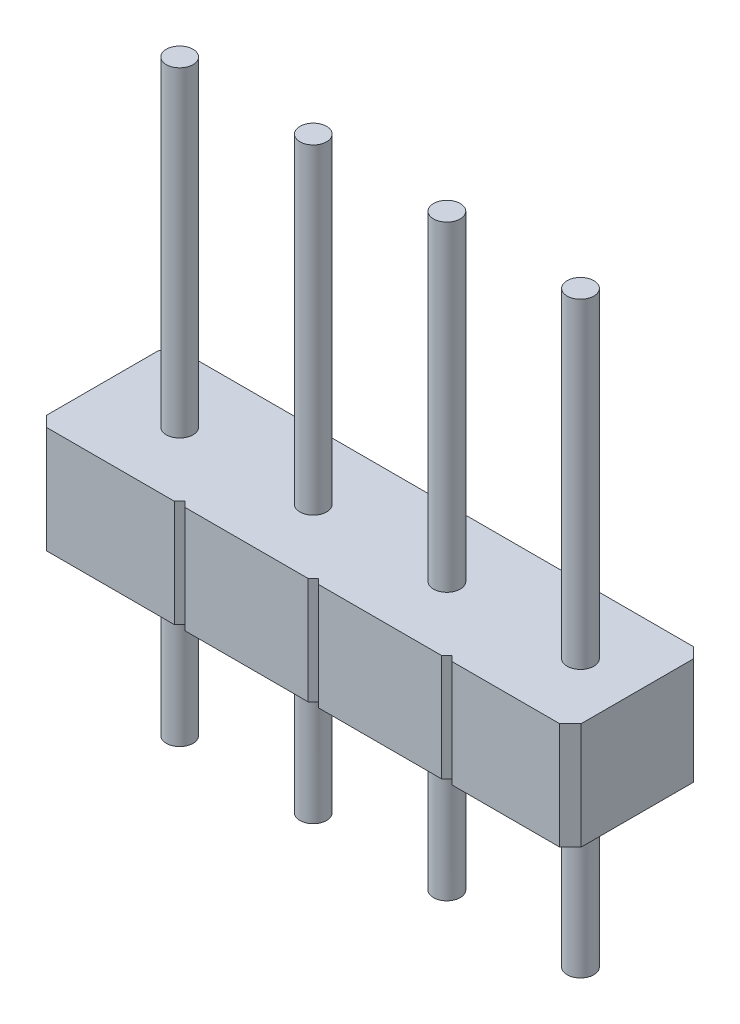
ISO-10303-21;
HEADER;
FILE_DESCRIPTION(('STEP AP214'),'2;1');
FILE_NAME('part.step','',(''),(''),'','','');
FILE_SCHEMA(('AUTOMOTIVE_DESIGN { 1 0 10303 214 1 1 1 1 }'));
ENDSEC;
DATA;
#1=APPLICATION_CONTEXT('core data for automotive mechanical design processes');
#2=APPLICATION_PROTOCOL_DEFINITION('international standard','automotive_design',2000,#1);
#3=PRODUCT_CONTEXT('',#1,'mechanical');
#4=PRODUCT('Part','Part','',(#3));
#5=PRODUCT_RELATED_PRODUCT_CATEGORY('part','',(#4));
#6=PRODUCT_DEFINITION_FORMATION('','',#4);
#7=PRODUCT_DEFINITION_CONTEXT('part definition',#1,'design');
#8=PRODUCT_DEFINITION('design','',#6,#7);
#9=PRODUCT_DEFINITION_SHAPE('','',#8);
#10=(LENGTH_UNIT() NAMED_UNIT(*) SI_UNIT(.MILLI.,.METRE.));
#11=(NAMED_UNIT(*) PLANE_ANGLE_UNIT() SI_UNIT($,.RADIAN.));
#12=(NAMED_UNIT(*) SI_UNIT($,.STERADIAN.) SOLID_ANGLE_UNIT());
#13=UNCERTAINTY_MEASURE_WITH_UNIT(LENGTH_MEASURE(1.E-05),#10,'distance_accuracy_value','');
#14=(GEOMETRIC_REPRESENTATION_CONTEXT(3) GLOBAL_UNCERTAINTY_ASSIGNED_CONTEXT((#13)) GLOBAL_UNIT_ASSIGNED_CONTEXT((#10,
#11,#12)) REPRESENTATION_CONTEXT('',''));
#15=CARTESIAN_POINT('',(0.,0.,0.));
#16=DIRECTION('',(0.,0.,1.));
#17=DIRECTION('',(1.,0.,0.));
#18=AXIS2_PLACEMENT_3D('',#15,#16,#17);
#19=CARTESIAN_POINT('',(0.,2.,0.));
#20=DIRECTION('',(0.,-1.,0.));
#21=DIRECTION('',(0.,0.,-1.));
#22=AXIS2_PLACEMENT_3D('',#19,#20,#21);
#23=PLANE('',#22);
#24=DIRECTION('',(-0.707106781186547,0.,0.707106781186548));
#25=VECTOR('',#24,1.);
#26=CARTESIAN_POINT('',(-5.,2.,-1.05));
#27=LINE('',#26,#25);
#28=CARTESIAN_POINT('',(-4.8,2.,-1.25));
#29=VERTEX_POINT('',#28);
#30=CARTESIAN_POINT('',(-5.,2.,-1.05));
#31=VERTEX_POINT('',#30);
#32=EDGE_CURVE('E290',#29,#31,#27,.T.);
#33=ORIENTED_EDGE('',*,*,#32,.T.);
#34=DIRECTION('',(0.,0.,1.));
#35=VECTOR('',#34,1.);
#36=CARTESIAN_POINT('',(-5.,2.,-1.05));
#37=LINE('',#36,#35);
#38=CARTESIAN_POINT('',(-5.,2.,1.05));
#39=VERTEX_POINT('',#38);
#40=EDGE_CURVE('E148',#31,#39,#37,.T.);
#41=ORIENTED_EDGE('',*,*,#40,.T.);
#42=DIRECTION('',(0.707106781186547,0.,0.707106781186548));
#43=VECTOR('',#42,1.);
#44=CARTESIAN_POINT('',(-5.,2.,1.05));
#45=LINE('',#44,#43);
#46=CARTESIAN_POINT('',(-4.8,2.,1.25));
#47=VERTEX_POINT('',#46);
#48=EDGE_CURVE('E359',#39,#47,#45,.T.);
#49=ORIENTED_EDGE('',*,*,#48,.T.);
#50=DIRECTION('',(1.,0.,0.));
#51=VECTOR('',#50,1.);
#52=CARTESIAN_POINT('',(-4.8,2.,1.25));
#53=LINE('',#52,#51);
#54=CARTESIAN_POINT('',(-2.41138997367375,2.,1.25));
#55=VERTEX_POINT('',#54);
#56=EDGE_CURVE('E378',#47,#55,#53,.T.);
#57=ORIENTED_EDGE('',*,*,#56,.T.);
#58=DIRECTION('',(0.707106781186545,0.,-0.70710678118655));
#59=VECTOR('',#58,1.);
#60=CARTESIAN_POINT('',(-2.41138997367375,2.,1.25));
#61=LINE('',#60,#59);
#62=CARTESIAN_POINT('',(-2.31138997367375,2.,1.15));
#63=VERTEX_POINT('',#62);
#64=EDGE_CURVE('E375',#55,#63,#61,.T.);
#65=ORIENTED_EDGE('',*,*,#64,.T.);
#66=DIRECTION('',(0.707106781186548,0.,0.707106781186547));
#67=VECTOR('',#66,1.);
#68=CARTESIAN_POINT('',(-2.31138997367375,2.,1.15));
#69=LINE('',#68,#67);
#70=CARTESIAN_POINT('',(-2.21138997367375,2.,1.25));
#71=VERTEX_POINT('',#70);
#72=EDGE_CURVE('E377',#63,#71,#69,.T.);
#73=ORIENTED_EDGE('',*,*,#72,.T.);
#74=DIRECTION('',(1.,0.,0.));
#75=VECTOR('',#74,1.);
#76=CARTESIAN_POINT('',(-2.21138997367375,2.,1.25));
#77=LINE('',#76,#75);
#78=CARTESIAN_POINT('',(0.0886100263262443,2.,1.25));
#79=VERTEX_POINT('',#78);
#80=EDGE_CURVE('E380',#71,#79,#77,.T.);
#81=ORIENTED_EDGE('',*,*,#80,.T.);
#82=DIRECTION('',(0.707106781186546,0.,-0.707106781186549));
#83=VECTOR('',#82,1.);
#84=CARTESIAN_POINT('',(0.0886100263262443,2.,1.25));
#85=LINE('',#84,#83);
#86=CARTESIAN_POINT('',(0.188610026326244,2.,1.15));
#87=VERTEX_POINT('',#86);
#88=EDGE_CURVE('E386',#79,#87,#85,.T.);
#89=ORIENTED_EDGE('',*,*,#88,.T.);
#90=DIRECTION('',(0.707106781186549,0.,0.707106781186546));
#91=VECTOR('',#90,1.);
#92=CARTESIAN_POINT('',(0.188610026326244,2.,1.15));
#93=LINE('',#92,#91);
#94=CARTESIAN_POINT('',(0.288610026326245,2.,1.25));
#95=VERTEX_POINT('',#94);
#96=EDGE_CURVE('E388',#87,#95,#93,.T.);
#97=ORIENTED_EDGE('',*,*,#96,.T.);
#98=DIRECTION('',(1.,0.,0.));
#99=VECTOR('',#98,1.);
#100=CARTESIAN_POINT('',(0.288610026326245,2.,1.25));
#101=LINE('',#100,#99);
#102=CARTESIAN_POINT('',(2.58861002632625,2.,1.25));
#103=VERTEX_POINT('',#102);
#104=EDGE_CURVE('E390',#95,#103,#101,.T.);
#105=ORIENTED_EDGE('',*,*,#104,.T.);
#106=DIRECTION('',(0.707106781186546,0.,-0.707106781186549));
#107=VECTOR('',#106,1.);
#108=CARTESIAN_POINT('',(2.58861002632625,2.,1.25));
#109=LINE('',#108,#107);
#110=CARTESIAN_POINT('',(2.68861002632624,2.,1.15));
#111=VERTEX_POINT('',#110);
#112=EDGE_CURVE('E392',#103,#111,#109,.T.);
#113=ORIENTED_EDGE('',*,*,#112,.T.);
#114=DIRECTION('',(0.707106781186549,0.,0.707106781186546));
#115=VECTOR('',#114,1.);
#116=CARTESIAN_POINT('',(2.68861002632624,2.,1.15));
#117=LINE('',#116,#115);
#118=CARTESIAN_POINT('',(2.78861002632624,2.,1.25));
#119=VERTEX_POINT('',#118);
#120=EDGE_CURVE('E394',#111,#119,#117,.T.);
#121=ORIENTED_EDGE('',*,*,#120,.T.);
#122=DIRECTION('',(1.,0.,0.));
#123=VECTOR('',#122,1.);
#124=CARTESIAN_POINT('',(2.78861002632624,2.,1.25));
#125=LINE('',#124,#123);
#126=CARTESIAN_POINT('',(4.8,2.,1.25));
#127=VERTEX_POINT('',#126);
#128=EDGE_CURVE('E396',#119,#127,#125,.T.);
#129=ORIENTED_EDGE('',*,*,#128,.T.);
#130=DIRECTION('',(0.707106781186547,0.,-0.707106781186548));
#131=VECTOR('',#130,1.);
#132=CARTESIAN_POINT('',(4.8,2.,1.25));
#133=LINE('',#132,#131);
#134=CARTESIAN_POINT('',(5.,2.,1.05));
#135=VERTEX_POINT('',#134);
#136=EDGE_CURVE('E398',#127,#135,#133,.T.);
#137=ORIENTED_EDGE('',*,*,#136,.T.);
#138=DIRECTION('',(0.,0.,-1.));
#139=VECTOR('',#138,1.);
#140=CARTESIAN_POINT('',(5.,2.,-1.05));
#141=LINE('',#140,#139);
#142=CARTESIAN_POINT('',(5.,2.,-1.05));
#143=VERTEX_POINT('',#142);
#144=EDGE_CURVE('E400',#135,#143,#141,.T.);
#145=ORIENTED_EDGE('',*,*,#144,.T.);
#146=DIRECTION('',(-0.707106781186547,0.,-0.707106781186548));
#147=VECTOR('',#146,1.);
#148=CARTESIAN_POINT('',(4.8,2.,-1.25));
#149=LINE('',#148,#147);
#150=CARTESIAN_POINT('',(4.8,2.,-1.25));
#151=VERTEX_POINT('',#150);
#152=EDGE_CURVE('E402',#143,#151,#149,.T.);
#153=ORIENTED_EDGE('',*,*,#152,.T.);
#154=DIRECTION('',(-1.,0.,0.));
#155=VECTOR('',#154,1.);
#156=CARTESIAN_POINT('',(2.78861002632624,2.,-1.25));
#157=LINE('',#156,#155);
#158=CARTESIAN_POINT('',(2.78861002632624,2.,-1.25));
#159=VERTEX_POINT('',#158);
#160=EDGE_CURVE('E404',#151,#159,#157,.T.);
#161=ORIENTED_EDGE('',*,*,#160,.T.);
#162=DIRECTION('',(-0.707106781186547,0.,0.707106781186548));
#163=VECTOR('',#162,1.);
#164=CARTESIAN_POINT('',(2.68861002632624,2.,-1.15));
#165=LINE('',#164,#163);
#166=CARTESIAN_POINT('',(2.68861002632624,2.,-1.15));
#167=VERTEX_POINT('',#166);
#168=EDGE_CURVE('E406',#159,#167,#165,.T.);
#169=ORIENTED_EDGE('',*,*,#168,.T.);
#170=DIRECTION('',(-0.707106781186547,0.,-0.707106781186548));
#171=VECTOR('',#170,1.);
#172=CARTESIAN_POINT('',(2.58861002632624,2.,-1.25));
#173=LINE('',#172,#171);
#174=CARTESIAN_POINT('',(2.58861002632624,2.,-1.25));
#175=VERTEX_POINT('',#174);
#176=EDGE_CURVE('E408',#167,#175,#173,.T.);
#177=ORIENTED_EDGE('',*,*,#176,.T.);
#178=DIRECTION('',(-1.,0.,0.));
#179=VECTOR('',#178,1.);
#180=CARTESIAN_POINT('',(0.288610026326243,2.,-1.25));
#181=LINE('',#180,#179);
#182=CARTESIAN_POINT('',(0.288610026326243,2.,-1.25));
#183=VERTEX_POINT('',#182);
#184=EDGE_CURVE('E410',#175,#183,#181,.T.);
#185=ORIENTED_EDGE('',*,*,#184,.T.);
#186=DIRECTION('',(-0.707106781186547,0.,0.707106781186549));
#187=VECTOR('',#186,1.);
#188=CARTESIAN_POINT('',(0.188610026326244,2.,-1.15));
#189=LINE('',#188,#187);
#190=CARTESIAN_POINT('',(0.188610026326244,2.,-1.15));
#191=VERTEX_POINT('',#190);
#192=EDGE_CURVE('E412',#183,#191,#189,.T.);
#193=ORIENTED_EDGE('',*,*,#192,.T.);
#194=DIRECTION('',(-0.707106781186549,0.,-0.707106781186546));
#195=VECTOR('',#194,1.);
#196=CARTESIAN_POINT('',(0.0886100263262439,2.,-1.25));
#197=LINE('',#196,#195);
#198=CARTESIAN_POINT('',(0.0886100263262439,2.,-1.25));
#199=VERTEX_POINT('',#198);
#200=EDGE_CURVE('E414',#191,#199,#197,.T.);
#201=ORIENTED_EDGE('',*,*,#200,.T.);
#202=DIRECTION('',(-1.,0.,0.));
#203=VECTOR('',#202,1.);
#204=CARTESIAN_POINT('',(-2.2107197566744,2.,-1.25));
#205=LINE('',#204,#203);
#206=CARTESIAN_POINT('',(-2.2107197566744,2.,-1.25));
#207=VERTEX_POINT('',#206);
#208=EDGE_CURVE('E221',#199,#207,#205,.T.);
#209=ORIENTED_EDGE('',*,*,#208,.T.);
#210=DIRECTION('',(-0.619239922198396,0.,0.785201833133191));
#211=VECTOR('',#210,1.);
#212=CARTESIAN_POINT('',(-2.31138997367376,2.,-1.12234925253336));
#213=LINE('',#212,#211);
#214=CARTESIAN_POINT('',(-2.31138997367376,2.,-1.12234925253336));
#215=VERTEX_POINT('',#214);
#216=EDGE_CURVE('E215',#207,#215,#213,.T.);
#217=ORIENTED_EDGE('',*,*,#216,.T.);
#218=DIRECTION('',(-0.619239922198393,0.,-0.785201833133194));
#219=VECTOR('',#218,1.);
#220=CARTESIAN_POINT('',(-2.41206019067311,2.,-1.25));
#221=LINE('',#220,#219);
#222=CARTESIAN_POINT('',(-2.41206019067311,2.,-1.25));
#223=VERTEX_POINT('',#222);
#224=EDGE_CURVE('E219',#215,#223,#221,.T.);
#225=ORIENTED_EDGE('',*,*,#224,.T.);
#226=DIRECTION('',(-1.,0.,0.));
#227=VECTOR('',#226,1.);
#228=CARTESIAN_POINT('',(-4.8,2.,-1.25));
#229=LINE('',#228,#227);
#230=EDGE_CURVE('E51',#223,#29,#229,.T.);
#231=ORIENTED_EDGE('',*,*,#230,.T.);
#232=EDGE_LOOP('',(#33,#41,#49,#57,#65,#73,#81,#89,#97,#105,#113,#121,#129,#137,#145,#153,#161,
#169,#177,#185,#193,#201,#209,#217,#225,#231));
#233=FACE_BOUND('',#232,.T.);
#234=CARTESIAN_POINT('',(-3.56138997367376,2.,0.));
#235=DIRECTION('',(0.,1.,0.));
#236=DIRECTION('',(0.,0.,1.));
#237=AXIS2_PLACEMENT_3D('',#234,#235,#236);
#238=CIRCLE('',#237,0.25);
#239=CARTESIAN_POINT('',(-3.56138997367376,2.,0.25));
#240=VERTEX_POINT('',#239);
#241=EDGE_CURVE('E243',#240,#240,#238,.T.);
#242=ORIENTED_EDGE('',*,*,#241,.F.);
#243=EDGE_LOOP('',(#242));
#244=FACE_BOUND('',#243,.T.);
#245=CARTESIAN_POINT('',(-1.06138997367376,2.,0.));
#246=DIRECTION('',(0.,1.,0.));
#247=DIRECTION('',(0.,0.,1.));
#248=AXIS2_PLACEMENT_3D('',#245,#246,#247);
#249=CIRCLE('',#248,0.25);
#250=CARTESIAN_POINT('',(-1.06138997367376,2.,0.25));
#251=VERTEX_POINT('',#250);
#252=EDGE_CURVE('E542',#251,#251,#249,.T.);
#253=ORIENTED_EDGE('',*,*,#252,.F.);
#254=EDGE_LOOP('',(#253));
#255=FACE_BOUND('',#254,.T.);
#256=CARTESIAN_POINT('',(1.43861002632624,2.,0.));
#257=DIRECTION('',(0.,1.,0.));
#258=DIRECTION('',(0.,0.,1.));
#259=AXIS2_PLACEMENT_3D('',#256,#257,#258);
#260=CIRCLE('',#259,0.25);
#261=CARTESIAN_POINT('',(1.43861002632624,2.,0.25));
#262=VERTEX_POINT('',#261);
#263=EDGE_CURVE('E539',#262,#262,#260,.T.);
#264=ORIENTED_EDGE('',*,*,#263,.F.);
#265=EDGE_LOOP('',(#264));
#266=FACE_BOUND('',#265,.T.);
#267=CARTESIAN_POINT('',(3.93861002632624,2.,0.));
#268=DIRECTION('',(0.,1.,0.));
#269=DIRECTION('',(0.,0.,1.));
#270=AXIS2_PLACEMENT_3D('',#267,#268,#269);
#271=CIRCLE('',#270,0.250000000000001);
#272=CARTESIAN_POINT('',(3.93861002632624,2.,0.250000000000001));
#273=VERTEX_POINT('',#272);
#274=EDGE_CURVE('E536',#273,#273,#271,.T.);
#275=ORIENTED_EDGE('',*,*,#274,.F.);
#276=EDGE_LOOP('',(#275));
#277=FACE_BOUND('',#276,.T.);
#278=ADVANCED_FACE('F34',(#233,#244,#255,#266,#277),#23,.F.);
#279=CARTESIAN_POINT('',(0.,0.,0.));
#280=DIRECTION('',(0.,-1.,0.));
#281=DIRECTION('',(0.,0.,-1.));
#282=AXIS2_PLACEMENT_3D('',#279,#280,#281);
#283=PLANE('',#282);
#284=CARTESIAN_POINT('',(1.43861002632624,0.,0.));
#285=DIRECTION('',(0.,-1.,0.));
#286=DIRECTION('',(0.,0.,-1.));
#287=AXIS2_PLACEMENT_3D('',#284,#285,#286);
#288=CIRCLE('',#287,0.25);
#289=CARTESIAN_POINT('',(1.43861002632624,0.,-0.25));
#290=VERTEX_POINT('',#289);
#291=EDGE_CURVE('E515',#290,#290,#288,.T.);
#292=ORIENTED_EDGE('',*,*,#291,.F.);
#293=EDGE_LOOP('',(#292));
#294=FACE_BOUND('',#293,.T.);
#295=CARTESIAN_POINT('',(-3.56138997367376,0.,0.));
#296=DIRECTION('',(0.,-1.,0.));
#297=DIRECTION('',(0.,0.,-1.));
#298=AXIS2_PLACEMENT_3D('',#295,#296,#297);
#299=CIRCLE('',#298,0.25);
#300=CARTESIAN_POINT('',(-3.56138997367376,0.,-0.25));
#301=VERTEX_POINT('',#300);
#302=EDGE_CURVE('E533',#301,#301,#299,.T.);
#303=ORIENTED_EDGE('',*,*,#302,.F.);
#304=EDGE_LOOP('',(#303));
#305=FACE_BOUND('',#304,.T.);
#306=DIRECTION('',(-0.707106781186547,0.,0.707106781186548));
#307=VECTOR('',#306,1.);
#308=CARTESIAN_POINT('',(-5.,0.,-1.05));
#309=LINE('',#308,#307);
#310=CARTESIAN_POINT('',(-4.8,0.,-1.25));
#311=VERTEX_POINT('',#310);
#312=CARTESIAN_POINT('',(-5.,0.,-1.05));
#313=VERTEX_POINT('',#312);
#314=EDGE_CURVE('E239',#311,#313,#309,.T.);
#315=ORIENTED_EDGE('',*,*,#314,.F.);
#316=DIRECTION('',(-1.,0.,0.));
#317=VECTOR('',#316,1.);
#318=CARTESIAN_POINT('',(-4.8,0.,-1.25));
#319=LINE('',#318,#317);
#320=CARTESIAN_POINT('',(-2.41206019067311,0.,-1.25));
#321=VERTEX_POINT('',#320);
#322=EDGE_CURVE('E140',#321,#311,#319,.T.);
#323=ORIENTED_EDGE('',*,*,#322,.F.);
#324=DIRECTION('',(-0.619239922198393,0.,-0.785201833133194));
#325=VECTOR('',#324,1.);
#326=CARTESIAN_POINT('',(-2.41206019067311,0.,-1.25));
#327=LINE('',#326,#325);
#328=CARTESIAN_POINT('',(-2.31138997367376,0.,-1.12234925253336));
#329=VERTEX_POINT('',#328);
#330=EDGE_CURVE('E134',#329,#321,#327,.T.);
#331=ORIENTED_EDGE('',*,*,#330,.F.);
#332=DIRECTION('',(-0.619239922198396,0.,0.785201833133191));
#333=VECTOR('',#332,1.);
#334=CARTESIAN_POINT('',(-2.31138997367376,0.,-1.12234925253336));
#335=LINE('',#334,#333);
#336=CARTESIAN_POINT('',(-2.2107197566744,0.,-1.25));
#337=VERTEX_POINT('',#336);
#338=EDGE_CURVE('E229',#337,#329,#335,.T.);
#339=ORIENTED_EDGE('',*,*,#338,.F.);
#340=DIRECTION('',(-1.,0.,0.));
#341=VECTOR('',#340,1.);
#342=CARTESIAN_POINT('',(-2.2107197566744,0.,-1.25));
#343=LINE('',#342,#341);
#344=CARTESIAN_POINT('',(0.0886100263262439,0.,-1.25));
#345=VERTEX_POINT('',#344);
#346=EDGE_CURVE('E285',#345,#337,#343,.T.);
#347=ORIENTED_EDGE('',*,*,#346,.F.);
#348=DIRECTION('',(-0.707106781186549,0.,-0.707106781186546));
#349=VECTOR('',#348,1.);
#350=CARTESIAN_POINT('',(0.0886100263262439,0.,-1.25));
#351=LINE('',#350,#349);
#352=CARTESIAN_POINT('',(0.188610026326244,0.,-1.15));
#353=VERTEX_POINT('',#352);
#354=EDGE_CURVE('E283',#353,#345,#351,.T.);
#355=ORIENTED_EDGE('',*,*,#354,.F.);
#356=DIRECTION('',(-0.707106781186547,0.,0.707106781186549));
#357=VECTOR('',#356,1.);
#358=CARTESIAN_POINT('',(0.188610026326244,0.,-1.15));
#359=LINE('',#358,#357);
#360=CARTESIAN_POINT('',(0.288610026326243,0.,-1.25));
#361=VERTEX_POINT('',#360);
#362=EDGE_CURVE('E281',#361,#353,#359,.T.);
#363=ORIENTED_EDGE('',*,*,#362,.F.);
#364=DIRECTION('',(-1.,0.,0.));
#365=VECTOR('',#364,1.);
#366=CARTESIAN_POINT('',(0.288610026326243,0.,-1.25));
#367=LINE('',#366,#365);
#368=CARTESIAN_POINT('',(2.58861002632624,0.,-1.25));
#369=VERTEX_POINT('',#368);
#370=EDGE_CURVE('E279',#369,#361,#367,.T.);
#371=ORIENTED_EDGE('',*,*,#370,.F.);
#372=DIRECTION('',(-0.707106781186547,0.,-0.707106781186548));
#373=VECTOR('',#372,1.);
#374=CARTESIAN_POINT('',(2.58861002632624,0.,-1.25));
#375=LINE('',#374,#373);
#376=CARTESIAN_POINT('',(2.68861002632624,0.,-1.15));
#377=VERTEX_POINT('',#376);
#378=EDGE_CURVE('E277',#377,#369,#375,.T.);
#379=ORIENTED_EDGE('',*,*,#378,.F.);
#380=DIRECTION('',(-0.707106781186547,0.,0.707106781186548));
#381=VECTOR('',#380,1.);
#382=CARTESIAN_POINT('',(2.68861002632624,0.,-1.15));
#383=LINE('',#382,#381);
#384=CARTESIAN_POINT('',(2.78861002632624,0.,-1.25));
#385=VERTEX_POINT('',#384);
#386=EDGE_CURVE('E275',#385,#377,#383,.T.);
#387=ORIENTED_EDGE('',*,*,#386,.F.);
#388=DIRECTION('',(-1.,0.,0.));
#389=VECTOR('',#388,1.);
#390=CARTESIAN_POINT('',(2.78861002632624,0.,-1.25));
#391=LINE('',#390,#389);
#392=CARTESIAN_POINT('',(4.8,0.,-1.25));
#393=VERTEX_POINT('',#392);
#394=EDGE_CURVE('E273',#393,#385,#391,.T.);
#395=ORIENTED_EDGE('',*,*,#394,.F.);
#396=DIRECTION('',(-0.707106781186547,0.,-0.707106781186548));
#397=VECTOR('',#396,1.);
#398=CARTESIAN_POINT('',(4.8,0.,-1.25));
#399=LINE('',#398,#397);
#400=CARTESIAN_POINT('',(5.,0.,-1.05));
#401=VERTEX_POINT('',#400);
#402=EDGE_CURVE('E271',#401,#393,#399,.T.);
#403=ORIENTED_EDGE('',*,*,#402,.F.);
#404=DIRECTION('',(0.,0.,-1.));
#405=VECTOR('',#404,1.);
#406=CARTESIAN_POINT('',(5.,0.,-1.05));
#407=LINE('',#406,#405);
#408=CARTESIAN_POINT('',(5.,0.,1.05));
#409=VERTEX_POINT('',#408);
#410=EDGE_CURVE('E269',#409,#401,#407,.T.);
#411=ORIENTED_EDGE('',*,*,#410,.F.);
#412=DIRECTION('',(0.707106781186547,0.,-0.707106781186548));
#413=VECTOR('',#412,1.);
#414=CARTESIAN_POINT('',(4.8,0.,1.25));
#415=LINE('',#414,#413);
#416=CARTESIAN_POINT('',(4.8,0.,1.25));
#417=VERTEX_POINT('',#416);
#418=EDGE_CURVE('E267',#417,#409,#415,.T.);
#419=ORIENTED_EDGE('',*,*,#418,.F.);
#420=DIRECTION('',(1.,0.,0.));
#421=VECTOR('',#420,1.);
#422=CARTESIAN_POINT('',(2.78861002632624,0.,1.25));
#423=LINE('',#422,#421);
#424=CARTESIAN_POINT('',(2.78861002632624,0.,1.25));
#425=VERTEX_POINT('',#424);
#426=EDGE_CURVE('E265',#425,#417,#423,.T.);
#427=ORIENTED_EDGE('',*,*,#426,.F.);
#428=DIRECTION('',(0.707106781186549,0.,0.707106781186546));
#429=VECTOR('',#428,1.);
#430=CARTESIAN_POINT('',(2.68861002632624,0.,1.15));
#431=LINE('',#430,#429);
#432=CARTESIAN_POINT('',(2.68861002632624,0.,1.15));
#433=VERTEX_POINT('',#432);
#434=EDGE_CURVE('E263',#433,#425,#431,.T.);
#435=ORIENTED_EDGE('',*,*,#434,.F.);
#436=DIRECTION('',(0.707106781186546,0.,-0.707106781186549));
#437=VECTOR('',#436,1.);
#438=CARTESIAN_POINT('',(2.58861002632625,0.,1.25));
#439=LINE('',#438,#437);
#440=CARTESIAN_POINT('',(2.58861002632625,0.,1.25));
#441=VERTEX_POINT('',#440);
#442=EDGE_CURVE('E261',#441,#433,#439,.T.);
#443=ORIENTED_EDGE('',*,*,#442,.F.);
#444=DIRECTION('',(1.,0.,0.));
#445=VECTOR('',#444,1.);
#446=CARTESIAN_POINT('',(0.288610026326245,0.,1.25));
#447=LINE('',#446,#445);
#448=CARTESIAN_POINT('',(0.288610026326245,0.,1.25));
#449=VERTEX_POINT('',#448);
#450=EDGE_CURVE('E259',#449,#441,#447,.T.);
#451=ORIENTED_EDGE('',*,*,#450,.F.);
#452=DIRECTION('',(0.707106781186549,0.,0.707106781186546));
#453=VECTOR('',#452,1.);
#454=CARTESIAN_POINT('',(0.188610026326244,0.,1.15));
#455=LINE('',#454,#453);
#456=CARTESIAN_POINT('',(0.188610026326244,0.,1.15));
#457=VERTEX_POINT('',#456);
#458=EDGE_CURVE('E257',#457,#449,#455,.T.);
#459=ORIENTED_EDGE('',*,*,#458,.F.);
#460=DIRECTION('',(0.707106781186546,0.,-0.707106781186549));
#461=VECTOR('',#460,1.);
#462=CARTESIAN_POINT('',(0.0886100263262443,0.,1.25));
#463=LINE('',#462,#461);
#464=CARTESIAN_POINT('',(0.0886100263262443,0.,1.25));
#465=VERTEX_POINT('',#464);
#466=EDGE_CURVE('E255',#465,#457,#463,.T.);
#467=ORIENTED_EDGE('',*,*,#466,.F.);
#468=DIRECTION('',(1.,0.,0.));
#469=VECTOR('',#468,1.);
#470=CARTESIAN_POINT('',(-2.21138997367375,0.,1.25));
#471=LINE('',#470,#469);
#472=CARTESIAN_POINT('',(-2.21138997367375,0.,1.25));
#473=VERTEX_POINT('',#472);
#474=EDGE_CURVE('E253',#473,#465,#471,.T.);
#475=ORIENTED_EDGE('',*,*,#474,.F.);
#476=DIRECTION('',(0.707106781186548,0.,0.707106781186547));
#477=VECTOR('',#476,1.);
#478=CARTESIAN_POINT('',(-2.31138997367375,0.,1.15));
#479=LINE('',#478,#477);
#480=CARTESIAN_POINT('',(-2.31138997367375,0.,1.15));
#481=VERTEX_POINT('',#480);
#482=EDGE_CURVE('E251',#481,#473,#479,.T.);
#483=ORIENTED_EDGE('',*,*,#482,.F.);
#484=DIRECTION('',(0.707106781186545,0.,-0.70710678118655));
#485=VECTOR('',#484,1.);
#486=CARTESIAN_POINT('',(-2.41138997367375,0.,1.25));
#487=LINE('',#486,#485);
#488=CARTESIAN_POINT('',(-2.41138997367375,0.,1.25));
#489=VERTEX_POINT('',#488);
#490=EDGE_CURVE('E249',#489,#481,#487,.T.);
#491=ORIENTED_EDGE('',*,*,#490,.F.);
#492=DIRECTION('',(1.,0.,0.));
#493=VECTOR('',#492,1.);
#494=CARTESIAN_POINT('',(-4.8,0.,1.25));
#495=LINE('',#494,#493);
#496=CARTESIAN_POINT('',(-4.8,0.,1.25));
#497=VERTEX_POINT('',#496);
#498=EDGE_CURVE('E247',#497,#489,#495,.T.);
#499=ORIENTED_EDGE('',*,*,#498,.F.);
#500=DIRECTION('',(0.707106781186547,0.,0.707106781186548));
#501=VECTOR('',#500,1.);
#502=CARTESIAN_POINT('',(-5.,0.,1.05));
#503=LINE('',#502,#501);
#504=CARTESIAN_POINT('',(-5.,0.,1.05));
#505=VERTEX_POINT('',#504);
#506=EDGE_CURVE('E245',#505,#497,#503,.T.);
#507=ORIENTED_EDGE('',*,*,#506,.F.);
#508=DIRECTION('',(0.,0.,1.));
#509=VECTOR('',#508,1.);
#510=CARTESIAN_POINT('',(-5.,0.,-1.05));
#511=LINE('',#510,#509);
#512=EDGE_CURVE('E242',#313,#505,#511,.T.);
#513=ORIENTED_EDGE('',*,*,#512,.F.);
#514=EDGE_LOOP('',(#315,#323,#331,#339,#347,#355,#363,#371,#379,#387,#395,#403,#411,#419,#427,
#435,#443,#451,#459,#467,#475,#483,#491,#499,#507,#513));
#515=FACE_BOUND('',#514,.T.);
#516=CARTESIAN_POINT('',(-1.06138997367376,0.,0.));
#517=DIRECTION('',(0.,-1.,0.));
#518=DIRECTION('',(0.,0.,-1.));
#519=AXIS2_PLACEMENT_3D('',#516,#517,#518);
#520=CIRCLE('',#519,0.25);
#521=CARTESIAN_POINT('',(-1.06138997367376,0.,-0.25));
#522=VERTEX_POINT('',#521);
#523=EDGE_CURVE('E524',#522,#522,#520,.T.);
#524=ORIENTED_EDGE('',*,*,#523,.F.);
#525=EDGE_LOOP('',(#524));
#526=FACE_BOUND('',#525,.T.);
#527=CARTESIAN_POINT('',(3.93861002632624,0.,0.));
#528=DIRECTION('',(0.,-1.,0.));
#529=DIRECTION('',(0.,0.,-1.));
#530=AXIS2_PLACEMENT_3D('',#527,#528,#529);
#531=CIRCLE('',#530,0.250000000000001);
#532=CARTESIAN_POINT('',(3.93861002632624,0.,-0.250000000000001));
#533=VERTEX_POINT('',#532);
#534=EDGE_CURVE('E504',#533,#533,#531,.T.);
#535=ORIENTED_EDGE('',*,*,#534,.F.);
#536=EDGE_LOOP('',(#535));
#537=FACE_BOUND('',#536,.T.);
#538=ADVANCED_FACE('F363',(#294,#305,#515,#526,#537),#283,.T.);
#539=CARTESIAN_POINT('',(-5.,2.,-1.05));
#540=DIRECTION('',(0.707106781186548,0.,0.707106781186547));
#541=DIRECTION('',(0.707106781186547,0.,-0.707106781186548));
#542=AXIS2_PLACEMENT_3D('',#539,#540,#541);
#543=PLANE('',#542);
#544=ORIENTED_EDGE('',*,*,#314,.T.);
#545=DIRECTION('',(0.,-1.,0.));
#546=VECTOR('',#545,1.);
#547=CARTESIAN_POINT('',(-5.,2.,-1.05));
#548=LINE('',#547,#546);
#549=EDGE_CURVE('E11',#31,#313,#548,.T.);
#550=ORIENTED_EDGE('',*,*,#549,.F.);
#551=ORIENTED_EDGE('',*,*,#32,.F.);
#552=DIRECTION('',(0.,-1.,0.));
#553=VECTOR('',#552,1.);
#554=CARTESIAN_POINT('',(-4.8,2.,-1.25));
#555=LINE('',#554,#553);
#556=EDGE_CURVE('E235',#29,#311,#555,.T.);
#557=ORIENTED_EDGE('',*,*,#556,.T.);
#558=EDGE_LOOP('',(#544,#550,#551,#557));
#559=FACE_BOUND('',#558,.T.);
#560=ADVANCED_FACE('F36',(#559),#543,.F.);
#561=CARTESIAN_POINT('',(-5.,2.,-1.05));
#562=DIRECTION('',(1.,0.,0.));
#563=DIRECTION('',(0.,0.,-1.));
#564=AXIS2_PLACEMENT_3D('',#561,#562,#563);
#565=PLANE('',#564);
#566=ORIENTED_EDGE('',*,*,#512,.T.);
#567=DIRECTION('',(0.,-1.,0.));
#568=VECTOR('',#567,1.);
#569=CARTESIAN_POINT('',(-5.,2.,1.05));
#570=LINE('',#569,#568);
#571=EDGE_CURVE('E43',#39,#505,#570,.T.);
#572=ORIENTED_EDGE('',*,*,#571,.F.);
#573=ORIENTED_EDGE('',*,*,#40,.F.);
#574=ORIENTED_EDGE('',*,*,#549,.T.);
#575=EDGE_LOOP('',(#566,#572,#573,#574));
#576=FACE_BOUND('',#575,.T.);
#577=ADVANCED_FACE('F844',(#576),#565,.F.);
#578=CARTESIAN_POINT('',(-5.,2.,1.05));
#579=DIRECTION('',(0.707106781186548,0.,-0.707106781186547));
#580=DIRECTION('',(-0.707106781186547,0.,-0.707106781186548));
#581=AXIS2_PLACEMENT_3D('',#578,#579,#580);
#582=PLANE('',#581);
#583=ORIENTED_EDGE('',*,*,#506,.T.);
#584=DIRECTION('',(0.,-1.,0.));
#585=VECTOR('',#584,1.);
#586=CARTESIAN_POINT('',(-4.8,2.,1.25));
#587=LINE('',#586,#585);
#588=EDGE_CURVE('E351',#47,#497,#587,.T.);
#589=ORIENTED_EDGE('',*,*,#588,.F.);
#590=ORIENTED_EDGE('',*,*,#48,.F.);
#591=ORIENTED_EDGE('',*,*,#571,.T.);
#592=EDGE_LOOP('',(#583,#589,#590,#591));
#593=FACE_BOUND('',#592,.T.);
#594=ADVANCED_FACE('F357',(#593),#582,.F.);
#595=CARTESIAN_POINT('',(-4.8,2.,1.25));
#596=DIRECTION('',(0.,0.,-1.));
#597=DIRECTION('',(-1.,0.,0.));
#598=AXIS2_PLACEMENT_3D('',#595,#596,#597);
#599=PLANE('',#598);
#600=ORIENTED_EDGE('',*,*,#498,.T.);
#601=DIRECTION('',(0.,-1.,0.));
#602=VECTOR('',#601,1.);
#603=CARTESIAN_POINT('',(-2.41138997367375,2.,1.25));
#604=LINE('',#603,#602);
#605=EDGE_CURVE('E348',#55,#489,#604,.T.);
#606=ORIENTED_EDGE('',*,*,#605,.F.);
#607=ORIENTED_EDGE('',*,*,#56,.F.);
#608=ORIENTED_EDGE('',*,*,#588,.T.);
#609=EDGE_LOOP('',(#600,#606,#607,#608));
#610=FACE_BOUND('',#609,.T.);
#611=ADVANCED_FACE('F369',(#610),#599,.F.);
#612=CARTESIAN_POINT('',(-2.41138997367375,2.,1.25));
#613=DIRECTION('',(-0.70710678118655,0.,-0.707106781186545));
#614=DIRECTION('',(-0.707106781186545,0.,0.70710678118655));
#615=AXIS2_PLACEMENT_3D('',#612,#613,#614);
#616=PLANE('',#615);
#617=ORIENTED_EDGE('',*,*,#490,.T.);
#618=DIRECTION('',(0.,-1.,0.));
#619=VECTOR('',#618,1.);
#620=CARTESIAN_POINT('',(-2.31138997367375,2.,1.15));
#621=LINE('',#620,#619);
#622=EDGE_CURVE('E345',#63,#481,#621,.T.);
#623=ORIENTED_EDGE('',*,*,#622,.F.);
#624=ORIENTED_EDGE('',*,*,#64,.F.);
#625=ORIENTED_EDGE('',*,*,#605,.T.);
#626=EDGE_LOOP('',(#617,#623,#624,#625));
#627=FACE_BOUND('',#626,.T.);
#628=ADVANCED_FACE('F373',(#627),#616,.F.);
#629=CARTESIAN_POINT('',(-2.31138997367375,2.,1.15));
#630=DIRECTION('',(0.707106781186547,0.,-0.707106781186548));
#631=DIRECTION('',(-0.707106781186548,0.,-0.707106781186547));
#632=AXIS2_PLACEMENT_3D('',#629,#630,#631);
#633=PLANE('',#632);
#634=ORIENTED_EDGE('',*,*,#482,.T.);
#635=DIRECTION('',(0.,-1.,0.));
#636=VECTOR('',#635,1.);
#637=CARTESIAN_POINT('',(-2.21138997367375,2.,1.25));
#638=LINE('',#637,#636);
#639=EDGE_CURVE('E342',#71,#473,#638,.T.);
#640=ORIENTED_EDGE('',*,*,#639,.F.);
#641=ORIENTED_EDGE('',*,*,#72,.F.);
#642=ORIENTED_EDGE('',*,*,#622,.T.);
#643=EDGE_LOOP('',(#634,#640,#641,#642));
#644=FACE_BOUND('',#643,.T.);
#645=ADVANCED_FACE('F813',(#644),#633,.F.);
#646=CARTESIAN_POINT('',(-2.21138997367375,2.,1.25));
#647=DIRECTION('',(0.,0.,-1.));
#648=DIRECTION('',(-1.,0.,0.));
#649=AXIS2_PLACEMENT_3D('',#646,#647,#648);
#650=PLANE('',#649);
#651=ORIENTED_EDGE('',*,*,#474,.T.);
#652=DIRECTION('',(0.,-1.,0.));
#653=VECTOR('',#652,1.);
#654=CARTESIAN_POINT('',(0.0886100263262443,2.,1.25));
#655=LINE('',#654,#653);
#656=EDGE_CURVE('E339',#79,#465,#655,.T.);
#657=ORIENTED_EDGE('',*,*,#656,.F.);
#658=ORIENTED_EDGE('',*,*,#80,.F.);
#659=ORIENTED_EDGE('',*,*,#639,.T.);
#660=EDGE_LOOP('',(#651,#657,#658,#659));
#661=FACE_BOUND('',#660,.T.);
#662=ADVANCED_FACE('F804',(#661),#650,.F.);
#663=CARTESIAN_POINT('',(0.0886100263262443,2.,1.25));
#664=DIRECTION('',(-0.707106781186549,0.,-0.707106781186546));
#665=DIRECTION('',(-0.707106781186546,0.,0.707106781186549));
#666=AXIS2_PLACEMENT_3D('',#663,#664,#665);
#667=PLANE('',#666);
#668=ORIENTED_EDGE('',*,*,#466,.T.);
#669=DIRECTION('',(0.,-1.,0.));
#670=VECTOR('',#669,1.);
#671=CARTESIAN_POINT('',(0.188610026326244,2.,1.15));
#672=LINE('',#671,#670);
#673=EDGE_CURVE('E336',#87,#457,#672,.T.);
#674=ORIENTED_EDGE('',*,*,#673,.F.);
#675=ORIENTED_EDGE('',*,*,#88,.F.);
#676=ORIENTED_EDGE('',*,*,#656,.T.);
#677=EDGE_LOOP('',(#668,#674,#675,#676));
#678=FACE_BOUND('',#677,.T.);
#679=ADVANCED_FACE('F795',(#678),#667,.F.);
#680=CARTESIAN_POINT('',(0.188610026326244,2.,1.15));
#681=DIRECTION('',(0.707106781186546,0.,-0.707106781186549));
#682=DIRECTION('',(-0.707106781186549,0.,-0.707106781186546));
#683=AXIS2_PLACEMENT_3D('',#680,#681,#682);
#684=PLANE('',#683);
#685=ORIENTED_EDGE('',*,*,#458,.T.);
#686=DIRECTION('',(0.,-1.,0.));
#687=VECTOR('',#686,1.);
#688=CARTESIAN_POINT('',(0.288610026326245,2.,1.25));
#689=LINE('',#688,#687);
#690=EDGE_CURVE('E333',#95,#449,#689,.T.);
#691=ORIENTED_EDGE('',*,*,#690,.F.);
#692=ORIENTED_EDGE('',*,*,#96,.F.);
#693=ORIENTED_EDGE('',*,*,#673,.T.);
#694=EDGE_LOOP('',(#685,#691,#692,#693));
#695=FACE_BOUND('',#694,.T.);
#696=ADVANCED_FACE('F786',(#695),#684,.F.);
#697=CARTESIAN_POINT('',(0.288610026326245,2.,1.25));
#698=DIRECTION('',(0.,0.,-1.));
#699=DIRECTION('',(-1.,0.,0.));
#700=AXIS2_PLACEMENT_3D('',#697,#698,#699);
#701=PLANE('',#700);
#702=ORIENTED_EDGE('',*,*,#450,.T.);
#703=DIRECTION('',(0.,-1.,0.));
#704=VECTOR('',#703,1.);
#705=CARTESIAN_POINT('',(2.58861002632625,2.,1.25));
#706=LINE('',#705,#704);
#707=EDGE_CURVE('E330',#103,#441,#706,.T.);
#708=ORIENTED_EDGE('',*,*,#707,.F.);
#709=ORIENTED_EDGE('',*,*,#104,.F.);
#710=ORIENTED_EDGE('',*,*,#690,.T.);
#711=EDGE_LOOP('',(#702,#708,#709,#710));
#712=FACE_BOUND('',#711,.T.);
#713=ADVANCED_FACE('F777',(#712),#701,.F.);
#714=CARTESIAN_POINT('',(2.58861002632625,2.,1.25));
#715=DIRECTION('',(-0.707106781186549,0.,-0.707106781186546));
#716=DIRECTION('',(-0.707106781186546,0.,0.707106781186549));
#717=AXIS2_PLACEMENT_3D('',#714,#715,#716);
#718=PLANE('',#717);
#719=ORIENTED_EDGE('',*,*,#442,.T.);
#720=DIRECTION('',(0.,-1.,0.));
#721=VECTOR('',#720,1.);
#722=CARTESIAN_POINT('',(2.68861002632624,2.,1.15));
#723=LINE('',#722,#721);
#724=EDGE_CURVE('E327',#111,#433,#723,.T.);
#725=ORIENTED_EDGE('',*,*,#724,.F.);
#726=ORIENTED_EDGE('',*,*,#112,.F.);
#727=ORIENTED_EDGE('',*,*,#707,.T.);
#728=EDGE_LOOP('',(#719,#725,#726,#727));
#729=FACE_BOUND('',#728,.T.);
#730=ADVANCED_FACE('F768',(#729),#718,.F.);
#731=CARTESIAN_POINT('',(2.68861002632624,2.,1.15));
#732=DIRECTION('',(0.707106781186546,0.,-0.707106781186549));
#733=DIRECTION('',(-0.707106781186549,0.,-0.707106781186546));
#734=AXIS2_PLACEMENT_3D('',#731,#732,#733);
#735=PLANE('',#734);
#736=ORIENTED_EDGE('',*,*,#434,.T.);
#737=DIRECTION('',(0.,-1.,0.));
#738=VECTOR('',#737,1.);
#739=CARTESIAN_POINT('',(2.78861002632624,2.,1.25));
#740=LINE('',#739,#738);
#741=EDGE_CURVE('E324',#119,#425,#740,.T.);
#742=ORIENTED_EDGE('',*,*,#741,.F.);
#743=ORIENTED_EDGE('',*,*,#120,.F.);
#744=ORIENTED_EDGE('',*,*,#724,.T.);
#745=EDGE_LOOP('',(#736,#742,#743,#744));
#746=FACE_BOUND('',#745,.T.);
#747=ADVANCED_FACE('F759',(#746),#735,.F.);
#748=CARTESIAN_POINT('',(2.78861002632624,2.,1.25));
#749=DIRECTION('',(0.,0.,-1.));
#750=DIRECTION('',(-1.,0.,0.));
#751=AXIS2_PLACEMENT_3D('',#748,#749,#750);
#752=PLANE('',#751);
#753=ORIENTED_EDGE('',*,*,#426,.T.);
#754=DIRECTION('',(0.,-1.,0.));
#755=VECTOR('',#754,1.);
#756=CARTESIAN_POINT('',(4.8,2.,1.25));
#757=LINE('',#756,#755);
#758=EDGE_CURVE('E321',#127,#417,#757,.T.);
#759=ORIENTED_EDGE('',*,*,#758,.F.);
#760=ORIENTED_EDGE('',*,*,#128,.F.);
#761=ORIENTED_EDGE('',*,*,#741,.T.);
#762=EDGE_LOOP('',(#753,#759,#760,#761));
#763=FACE_BOUND('',#762,.T.);
#764=ADVANCED_FACE('F750',(#763),#752,.F.);
#765=CARTESIAN_POINT('',(4.8,2.,1.25));
#766=DIRECTION('',(-0.707106781186548,0.,-0.707106781186547));
#767=DIRECTION('',(-0.707106781186547,0.,0.707106781186548));
#768=AXIS2_PLACEMENT_3D('',#765,#766,#767);
#769=PLANE('',#768);
#770=ORIENTED_EDGE('',*,*,#418,.T.);
#771=DIRECTION('',(0.,-1.,0.));
#772=VECTOR('',#771,1.);
#773=CARTESIAN_POINT('',(5.,2.,1.05));
#774=LINE('',#773,#772);
#775=EDGE_CURVE('E318',#135,#409,#774,.T.);
#776=ORIENTED_EDGE('',*,*,#775,.F.);
#777=ORIENTED_EDGE('',*,*,#136,.F.);
#778=ORIENTED_EDGE('',*,*,#758,.T.);
#779=EDGE_LOOP('',(#770,#776,#777,#778));
#780=FACE_BOUND('',#779,.T.);
#781=ADVANCED_FACE('F741',(#780),#769,.F.);
#782=CARTESIAN_POINT('',(5.,2.,-1.05));
#783=DIRECTION('',(-1.,0.,0.));
#784=DIRECTION('',(0.,0.,1.));
#785=AXIS2_PLACEMENT_3D('',#782,#783,#784);
#786=PLANE('',#785);
#787=ORIENTED_EDGE('',*,*,#410,.T.);
#788=DIRECTION('',(0.,-1.,0.));
#789=VECTOR('',#788,1.);
#790=CARTESIAN_POINT('',(5.,2.,-1.05));
#791=LINE('',#790,#789);
#792=EDGE_CURVE('E315',#143,#401,#791,.T.);
#793=ORIENTED_EDGE('',*,*,#792,.F.);
#794=ORIENTED_EDGE('',*,*,#144,.F.);
#795=ORIENTED_EDGE('',*,*,#775,.T.);
#796=EDGE_LOOP('',(#787,#793,#794,#795));
#797=FACE_BOUND('',#796,.T.);
#798=ADVANCED_FACE('F732',(#797),#786,.F.);
#799=CARTESIAN_POINT('',(4.8,2.,-1.25));
#800=DIRECTION('',(-0.707106781186548,0.,0.707106781186547));
#801=DIRECTION('',(0.707106781186547,0.,0.707106781186548));
#802=AXIS2_PLACEMENT_3D('',#799,#800,#801);
#803=PLANE('',#802);
#804=ORIENTED_EDGE('',*,*,#402,.T.);
#805=DIRECTION('',(0.,-1.,0.));
#806=VECTOR('',#805,1.);
#807=CARTESIAN_POINT('',(4.8,2.,-1.25));
#808=LINE('',#807,#806);
#809=EDGE_CURVE('E312',#151,#393,#808,.T.);
#810=ORIENTED_EDGE('',*,*,#809,.F.);
#811=ORIENTED_EDGE('',*,*,#152,.F.);
#812=ORIENTED_EDGE('',*,*,#792,.T.);
#813=EDGE_LOOP('',(#804,#810,#811,#812));
#814=FACE_BOUND('',#813,.T.);
#815=ADVANCED_FACE('F723',(#814),#803,.F.);
#816=CARTESIAN_POINT('',(2.78861002632624,2.,-1.25));
#817=DIRECTION('',(0.,0.,1.));
#818=DIRECTION('',(1.,0.,0.));
#819=AXIS2_PLACEMENT_3D('',#816,#817,#818);
#820=PLANE('',#819);
#821=ORIENTED_EDGE('',*,*,#394,.T.);
#822=DIRECTION('',(0.,-1.,0.));
#823=VECTOR('',#822,1.);
#824=CARTESIAN_POINT('',(2.78861002632624,2.,-1.25));
#825=LINE('',#824,#823);
#826=EDGE_CURVE('E309',#159,#385,#825,.T.);
#827=ORIENTED_EDGE('',*,*,#826,.F.);
#828=ORIENTED_EDGE('',*,*,#160,.F.);
#829=ORIENTED_EDGE('',*,*,#809,.T.);
#830=EDGE_LOOP('',(#821,#827,#828,#829));
#831=FACE_BOUND('',#830,.T.);
#832=ADVANCED_FACE('F714',(#831),#820,.F.);
#833=CARTESIAN_POINT('',(2.68861002632624,2.,-1.15));
#834=DIRECTION('',(0.707106781186548,0.,0.707106781186547));
#835=DIRECTION('',(0.707106781186547,0.,-0.707106781186548));
#836=AXIS2_PLACEMENT_3D('',#833,#834,#835);
#837=PLANE('',#836);
#838=ORIENTED_EDGE('',*,*,#386,.T.);
#839=DIRECTION('',(0.,-1.,0.));
#840=VECTOR('',#839,1.);
#841=CARTESIAN_POINT('',(2.68861002632624,2.,-1.15));
#842=LINE('',#841,#840);
#843=EDGE_CURVE('E306',#167,#377,#842,.T.);
#844=ORIENTED_EDGE('',*,*,#843,.F.);
#845=ORIENTED_EDGE('',*,*,#168,.F.);
#846=ORIENTED_EDGE('',*,*,#826,.T.);
#847=EDGE_LOOP('',(#838,#844,#845,#846));
#848=FACE_BOUND('',#847,.T.);
#849=ADVANCED_FACE('F705',(#848),#837,.F.);
#850=CARTESIAN_POINT('',(2.58861002632624,2.,-1.25));
#851=DIRECTION('',(-0.707106781186548,0.,0.707106781186547));
#852=DIRECTION('',(0.707106781186547,0.,0.707106781186548));
#853=AXIS2_PLACEMENT_3D('',#850,#851,#852);
#854=PLANE('',#853);
#855=ORIENTED_EDGE('',*,*,#378,.T.);
#856=DIRECTION('',(0.,-1.,0.));
#857=VECTOR('',#856,1.);
#858=CARTESIAN_POINT('',(2.58861002632624,2.,-1.25));
#859=LINE('',#858,#857);
#860=EDGE_CURVE('E303',#175,#369,#859,.T.);
#861=ORIENTED_EDGE('',*,*,#860,.F.);
#862=ORIENTED_EDGE('',*,*,#176,.F.);
#863=ORIENTED_EDGE('',*,*,#843,.T.);
#864=EDGE_LOOP('',(#855,#861,#862,#863));
#865=FACE_BOUND('',#864,.T.);
#866=ADVANCED_FACE('F696',(#865),#854,.F.);
#867=CARTESIAN_POINT('',(0.288610026326243,2.,-1.25));
#868=DIRECTION('',(0.,0.,1.));
#869=DIRECTION('',(1.,0.,0.));
#870=AXIS2_PLACEMENT_3D('',#867,#868,#869);
#871=PLANE('',#870);
#872=ORIENTED_EDGE('',*,*,#370,.T.);
#873=DIRECTION('',(0.,-1.,0.));
#874=VECTOR('',#873,1.);
#875=CARTESIAN_POINT('',(0.288610026326243,2.,-1.25));
#876=LINE('',#875,#874);
#877=EDGE_CURVE('E300',#183,#361,#876,.T.);
#878=ORIENTED_EDGE('',*,*,#877,.F.);
#879=ORIENTED_EDGE('',*,*,#184,.F.);
#880=ORIENTED_EDGE('',*,*,#860,.T.);
#881=EDGE_LOOP('',(#872,#878,#879,#880));
#882=FACE_BOUND('',#881,.T.);
#883=ADVANCED_FACE('F687',(#882),#871,.F.);
#884=CARTESIAN_POINT('',(0.188610026326244,2.,-1.15));
#885=DIRECTION('',(0.707106781186549,0.,0.707106781186547));
#886=DIRECTION('',(0.707106781186547,0.,-0.707106781186549));
#887=AXIS2_PLACEMENT_3D('',#884,#885,#886);
#888=PLANE('',#887);
#889=ORIENTED_EDGE('',*,*,#362,.T.);
#890=DIRECTION('',(0.,-1.,0.));
#891=VECTOR('',#890,1.);
#892=CARTESIAN_POINT('',(0.188610026326244,2.,-1.15));
#893=LINE('',#892,#891);
#894=EDGE_CURVE('E297',#191,#353,#893,.T.);
#895=ORIENTED_EDGE('',*,*,#894,.F.);
#896=ORIENTED_EDGE('',*,*,#192,.F.);
#897=ORIENTED_EDGE('',*,*,#877,.T.);
#898=EDGE_LOOP('',(#889,#895,#896,#897));
#899=FACE_BOUND('',#898,.T.);
#900=ADVANCED_FACE('F679',(#899),#888,.F.);
#901=CARTESIAN_POINT('',(0.0886100263262439,2.,-1.25));
#902=DIRECTION('',(-0.707106781186546,0.,0.707106781186549));
#903=DIRECTION('',(0.707106781186549,0.,0.707106781186546));
#904=AXIS2_PLACEMENT_3D('',#901,#902,#903);
#905=PLANE('',#904);
#906=ORIENTED_EDGE('',*,*,#354,.T.);
#907=DIRECTION('',(0.,-1.,0.));
#908=VECTOR('',#907,1.);
#909=CARTESIAN_POINT('',(0.0886100263262439,2.,-1.25));
#910=LINE('',#909,#908);
#911=EDGE_CURVE('E294',#199,#345,#910,.T.);
#912=ORIENTED_EDGE('',*,*,#911,.F.);
#913=ORIENTED_EDGE('',*,*,#200,.F.);
#914=ORIENTED_EDGE('',*,*,#894,.T.);
#915=EDGE_LOOP('',(#906,#912,#913,#914));
#916=FACE_BOUND('',#915,.T.);
#917=ADVANCED_FACE('F420',(#916),#905,.F.);
#918=CARTESIAN_POINT('',(-2.2107197566744,2.,-1.25));
#919=DIRECTION('',(0.,0.,1.));
#920=DIRECTION('',(1.,0.,0.));
#921=AXIS2_PLACEMENT_3D('',#918,#919,#920);
#922=PLANE('',#921);
#923=ORIENTED_EDGE('',*,*,#346,.T.);
#924=DIRECTION('',(0.,-1.,0.));
#925=VECTOR('',#924,1.);
#926=CARTESIAN_POINT('',(-2.2107197566744,2.,-1.25));
#927=LINE('',#926,#925);
#928=EDGE_CURVE('E230',#207,#337,#927,.T.);
#929=ORIENTED_EDGE('',*,*,#928,.F.);
#930=ORIENTED_EDGE('',*,*,#208,.F.);
#931=ORIENTED_EDGE('',*,*,#911,.T.);
#932=EDGE_LOOP('',(#923,#929,#930,#931));
#933=FACE_BOUND('',#932,.T.);
#934=ADVANCED_FACE('F424',(#933),#922,.F.);
#935=CARTESIAN_POINT('',(-2.31138997367376,2.,-1.12234925253336));
#936=DIRECTION('',(0.785201833133191,0.,0.619239922198397));
#937=DIRECTION('',(0.619239922198397,0.,-0.785201833133191));
#938=AXIS2_PLACEMENT_3D('',#935,#936,#937);
#939=PLANE('',#938);
#940=ORIENTED_EDGE('',*,*,#338,.T.);
#941=DIRECTION('',(0.,-1.,0.));
#942=VECTOR('',#941,1.);
#943=CARTESIAN_POINT('',(-2.31138997367376,2.,-1.12234925253336));
#944=LINE('',#943,#942);
#945=EDGE_CURVE('E226',#215,#329,#944,.T.);
#946=ORIENTED_EDGE('',*,*,#945,.F.);
#947=ORIENTED_EDGE('',*,*,#216,.F.);
#948=ORIENTED_EDGE('',*,*,#928,.T.);
#949=EDGE_LOOP('',(#940,#946,#947,#948));
#950=FACE_BOUND('',#949,.T.);
#951=ADVANCED_FACE('F227',(#950),#939,.F.);
#952=CARTESIAN_POINT('',(-2.41206019067311,2.,-1.25));
#953=DIRECTION('',(-0.785201833133194,0.,0.619239922198393));
#954=DIRECTION('',(0.619239922198393,0.,0.785201833133194));
#955=AXIS2_PLACEMENT_3D('',#952,#953,#954);
#956=PLANE('',#955);
#957=ORIENTED_EDGE('',*,*,#330,.T.);
#958=DIRECTION('',(0.,-1.,0.));
#959=VECTOR('',#958,1.);
#960=CARTESIAN_POINT('',(-2.41206019067311,2.,-1.25));
#961=LINE('',#960,#959);
#962=EDGE_CURVE('E231',#223,#321,#961,.T.);
#963=ORIENTED_EDGE('',*,*,#962,.F.);
#964=ORIENTED_EDGE('',*,*,#224,.F.);
#965=ORIENTED_EDGE('',*,*,#945,.T.);
#966=EDGE_LOOP('',(#957,#963,#964,#965));
#967=FACE_BOUND('',#966,.T.);
#968=ADVANCED_FACE('F233',(#967),#956,.F.);
#969=CARTESIAN_POINT('',(-4.8,2.,-1.25));
#970=DIRECTION('',(0.,0.,1.));
#971=DIRECTION('',(1.,0.,0.));
#972=AXIS2_PLACEMENT_3D('',#969,#970,#971);
#973=PLANE('',#972);
#974=ORIENTED_EDGE('',*,*,#322,.T.);
#975=ORIENTED_EDGE('',*,*,#556,.F.);
#976=ORIENTED_EDGE('',*,*,#230,.F.);
#977=ORIENTED_EDGE('',*,*,#962,.T.);
#978=EDGE_LOOP('',(#974,#975,#976,#977));
#979=FACE_BOUND('',#978,.T.);
#980=ADVANCED_FACE('F428',(#979),#973,.F.);
#981=CARTESIAN_POINT('',(-3.56138997367376,-3.,0.));
#982=DIRECTION('',(0.,1.,0.));
#983=DIRECTION('',(0.,0.,1.));
#984=AXIS2_PLACEMENT_3D('',#981,#982,#983);
#985=PLANE('',#984);
#986=CARTESIAN_POINT('',(-3.56138997367376,-3.,0.));
#987=DIRECTION('',(0.,1.,0.));
#988=DIRECTION('',(0.,0.,1.));
#989=AXIS2_PLACEMENT_3D('',#986,#987,#988);
#990=CIRCLE('',#989,0.25);
#991=CARTESIAN_POINT('',(-3.56138997367376,-3.,0.25));
#992=VERTEX_POINT('',#991);
#993=EDGE_CURVE('E530',#992,#992,#990,.T.);
#994=ORIENTED_EDGE('',*,*,#993,.F.);
#995=EDGE_LOOP('',(#994));
#996=FACE_BOUND('',#995,.T.);
#997=ADVANCED_FACE('F430',(#996),#985,.F.);
#998=CARTESIAN_POINT('',(-3.56138997367376,-3.,0.));
#999=DIRECTION('',(0.,1.,0.));
#1000=DIRECTION('',(0.,0.,1.));
#1001=AXIS2_PLACEMENT_3D('',#998,#999,#1000);
#1002=CYLINDRICAL_SURFACE('',#1001,0.25);
#1003=ORIENTED_EDGE('',*,*,#302,.T.);
#1004=EDGE_LOOP('',(#1003));
#1005=FACE_BOUND('',#1004,.T.);
#1006=ORIENTED_EDGE('',*,*,#993,.T.);
#1007=EDGE_LOOP('',(#1006));
#1008=FACE_BOUND('',#1007,.T.);
#1009=ADVANCED_FACE('F436',(#1005,#1008),#1002,.T.);
#1010=CARTESIAN_POINT('',(-3.56138997367376,8.,0.));
#1011=DIRECTION('',(0.,1.,0.));
#1012=DIRECTION('',(0.,0.,1.));
#1013=AXIS2_PLACEMENT_3D('',#1010,#1011,#1012);
#1014=CIRCLE('',#1013,0.25);
#1015=CARTESIAN_POINT('',(-3.56138997367376,8.,0.25));
#1016=VERTEX_POINT('',#1015);
#1017=EDGE_CURVE('E527',#1016,#1016,#1014,.T.);
#1018=ORIENTED_EDGE('',*,*,#1017,.F.);
#1019=EDGE_LOOP('',(#1018));
#1020=FACE_BOUND('',#1019,.T.);
#1021=ORIENTED_EDGE('',*,*,#241,.T.);
#1022=EDGE_LOOP('',(#1021));
#1023=FACE_BOUND('',#1022,.T.);
#1024=ADVANCED_FACE('F449',(#1020,#1023),#1002,.T.);
#1025=CARTESIAN_POINT('',(-3.56138997367376,8.,0.));
#1026=DIRECTION('',(0.,1.,0.));
#1027=DIRECTION('',(0.,0.,1.));
#1028=AXIS2_PLACEMENT_3D('',#1025,#1026,#1027);
#1029=PLANE('',#1028);
#1030=ORIENTED_EDGE('',*,*,#1017,.T.);
#1031=EDGE_LOOP('',(#1030));
#1032=FACE_BOUND('',#1031,.T.);
#1033=ADVANCED_FACE('F452',(#1032),#1029,.T.);
#1034=CARTESIAN_POINT('',(-1.06138997367376,-3.,0.));
#1035=DIRECTION('',(0.,1.,0.));
#1036=DIRECTION('',(0.,0.,1.));
#1037=AXIS2_PLACEMENT_3D('',#1034,#1035,#1036);
#1038=PLANE('',#1037);
#1039=CARTESIAN_POINT('',(-1.06138997367376,-3.,0.));
#1040=DIRECTION('',(0.,1.,0.));
#1041=DIRECTION('',(0.,0.,1.));
#1042=AXIS2_PLACEMENT_3D('',#1039,#1040,#1041);
#1043=CIRCLE('',#1042,0.25);
#1044=CARTESIAN_POINT('',(-1.06138997367376,-3.,0.25));
#1045=VERTEX_POINT('',#1044);
#1046=EDGE_CURVE('E521',#1045,#1045,#1043,.T.);
#1047=ORIENTED_EDGE('',*,*,#1046,.F.);
#1048=EDGE_LOOP('',(#1047));
#1049=FACE_BOUND('',#1048,.T.);
#1050=ADVANCED_FACE('F455',(#1049),#1038,.F.);
#1051=CARTESIAN_POINT('',(-1.06138997367376,-3.,0.));
#1052=DIRECTION('',(0.,1.,0.));
#1053=DIRECTION('',(0.,0.,1.));
#1054=AXIS2_PLACEMENT_3D('',#1051,#1052,#1053);
#1055=CYLINDRICAL_SURFACE('',#1054,0.25);
#1056=ORIENTED_EDGE('',*,*,#523,.T.);
#1057=EDGE_LOOP('',(#1056));
#1058=FACE_BOUND('',#1057,.T.);
#1059=ORIENTED_EDGE('',*,*,#1046,.T.);
#1060=EDGE_LOOP('',(#1059));
#1061=FACE_BOUND('',#1060,.T.);
#1062=ADVANCED_FACE('F457',(#1058,#1061),#1055,.T.);
#1063=CARTESIAN_POINT('',(-1.06138997367376,8.,0.));
#1064=DIRECTION('',(0.,1.,0.));
#1065=DIRECTION('',(0.,0.,1.));
#1066=AXIS2_PLACEMENT_3D('',#1063,#1064,#1065);
#1067=CIRCLE('',#1066,0.25);
#1068=CARTESIAN_POINT('',(-1.06138997367376,8.,0.25));
#1069=VERTEX_POINT('',#1068);
#1070=EDGE_CURVE('E518',#1069,#1069,#1067,.T.);
#1071=ORIENTED_EDGE('',*,*,#1070,.F.);
#1072=EDGE_LOOP('',(#1071));
#1073=FACE_BOUND('',#1072,.T.);
#1074=ORIENTED_EDGE('',*,*,#252,.T.);
#1075=EDGE_LOOP('',(#1074));
#1076=FACE_BOUND('',#1075,.T.);
#1077=ADVANCED_FACE('F460',(#1073,#1076),#1055,.T.);
#1078=CARTESIAN_POINT('',(-1.06138997367376,8.,0.));
#1079=DIRECTION('',(0.,1.,0.));
#1080=DIRECTION('',(0.,0.,1.));
#1081=AXIS2_PLACEMENT_3D('',#1078,#1079,#1080);
#1082=PLANE('',#1081);
#1083=ORIENTED_EDGE('',*,*,#1070,.T.);
#1084=EDGE_LOOP('',(#1083));
#1085=FACE_BOUND('',#1084,.T.);
#1086=ADVANCED_FACE('F465',(#1085),#1082,.T.);
#1087=CARTESIAN_POINT('',(1.43861002632624,-3.,0.));
#1088=DIRECTION('',(0.,1.,0.));
#1089=DIRECTION('',(0.,0.,1.));
#1090=AXIS2_PLACEMENT_3D('',#1087,#1088,#1089);
#1091=PLANE('',#1090);
#1092=CARTESIAN_POINT('',(1.43861002632624,-3.,0.));
#1093=DIRECTION('',(0.,1.,0.));
#1094=DIRECTION('',(0.,0.,1.));
#1095=AXIS2_PLACEMENT_3D('',#1092,#1093,#1094);
#1096=CIRCLE('',#1095,0.25);
#1097=CARTESIAN_POINT('',(1.43861002632624,-3.,0.25));
#1098=VERTEX_POINT('',#1097);
#1099=EDGE_CURVE('E512',#1098,#1098,#1096,.T.);
#1100=ORIENTED_EDGE('',*,*,#1099,.F.);
#1101=EDGE_LOOP('',(#1100));
#1102=FACE_BOUND('',#1101,.T.);
#1103=ADVANCED_FACE('F468',(#1102),#1091,.F.);
#1104=CARTESIAN_POINT('',(1.43861002632624,-3.,0.));
#1105=DIRECTION('',(0.,1.,0.));
#1106=DIRECTION('',(0.,0.,1.));
#1107=AXIS2_PLACEMENT_3D('',#1104,#1105,#1106);
#1108=CYLINDRICAL_SURFACE('',#1107,0.25);
#1109=ORIENTED_EDGE('',*,*,#291,.T.);
#1110=EDGE_LOOP('',(#1109));
#1111=FACE_BOUND('',#1110,.T.);
#1112=ORIENTED_EDGE('',*,*,#1099,.T.);
#1113=EDGE_LOOP('',(#1112));
#1114=FACE_BOUND('',#1113,.T.);
#1115=ADVANCED_FACE('F470',(#1111,#1114),#1108,.T.);
#1116=CARTESIAN_POINT('',(1.43861002632624,8.,0.));
#1117=DIRECTION('',(0.,1.,0.));
#1118=DIRECTION('',(0.,0.,1.));
#1119=AXIS2_PLACEMENT_3D('',#1116,#1117,#1118);
#1120=CIRCLE('',#1119,0.25);
#1121=CARTESIAN_POINT('',(1.43861002632624,8.,0.25));
#1122=VERTEX_POINT('',#1121);
#1123=EDGE_CURVE('E509',#1122,#1122,#1120,.T.);
#1124=ORIENTED_EDGE('',*,*,#1123,.F.);
#1125=EDGE_LOOP('',(#1124));
#1126=FACE_BOUND('',#1125,.T.);
#1127=ORIENTED_EDGE('',*,*,#263,.T.);
#1128=EDGE_LOOP('',(#1127));
#1129=FACE_BOUND('',#1128,.T.);
#1130=ADVANCED_FACE('F473',(#1126,#1129),#1108,.T.);
#1131=CARTESIAN_POINT('',(1.43861002632624,8.,0.));
#1132=DIRECTION('',(0.,1.,0.));
#1133=DIRECTION('',(0.,0.,1.));
#1134=AXIS2_PLACEMENT_3D('',#1131,#1132,#1133);
#1135=PLANE('',#1134);
#1136=ORIENTED_EDGE('',*,*,#1123,.T.);
#1137=EDGE_LOOP('',(#1136));
#1138=FACE_BOUND('',#1137,.T.);
#1139=ADVANCED_FACE('F478',(#1138),#1135,.T.);
#1140=CARTESIAN_POINT('',(3.93861002632624,-3.,0.));
#1141=DIRECTION('',(0.,1.,0.));
#1142=DIRECTION('',(0.,0.,1.));
#1143=AXIS2_PLACEMENT_3D('',#1140,#1141,#1142);
#1144=PLANE('',#1143);
#1145=CARTESIAN_POINT('',(3.93861002632624,-3.,0.));
#1146=DIRECTION('',(0.,1.,0.));
#1147=DIRECTION('',(0.,0.,1.));
#1148=AXIS2_PLACEMENT_3D('',#1145,#1146,#1147);
#1149=CIRCLE('',#1148,0.250000000000001);
#1150=CARTESIAN_POINT('',(3.93861002632624,-3.,0.250000000000001));
#1151=VERTEX_POINT('',#1150);
#1152=EDGE_CURVE('E501',#1151,#1151,#1149,.T.);
#1153=ORIENTED_EDGE('',*,*,#1152,.F.);
#1154=EDGE_LOOP('',(#1153));
#1155=FACE_BOUND('',#1154,.T.);
#1156=ADVANCED_FACE('F481',(#1155),#1144,.F.);
#1157=CARTESIAN_POINT('',(3.93861002632624,-3.,0.));
#1158=DIRECTION('',(0.,1.,0.));
#1159=DIRECTION('',(0.,0.,1.));
#1160=AXIS2_PLACEMENT_3D('',#1157,#1158,#1159);
#1161=CYLINDRICAL_SURFACE('',#1160,0.250000000000001);
#1162=ORIENTED_EDGE('',*,*,#534,.T.);
#1163=EDGE_LOOP('',(#1162));
#1164=FACE_BOUND('',#1163,.T.);
#1165=ORIENTED_EDGE('',*,*,#1152,.T.);
#1166=EDGE_LOOP('',(#1165));
#1167=FACE_BOUND('',#1166,.T.);
#1168=ADVANCED_FACE('F483',(#1164,#1167),#1161,.T.);
#1169=CARTESIAN_POINT('',(3.93861002632624,8.,0.));
#1170=DIRECTION('',(0.,1.,0.));
#1171=DIRECTION('',(0.,0.,1.));
#1172=AXIS2_PLACEMENT_3D('',#1169,#1170,#1171);
#1173=CIRCLE('',#1172,0.250000000000001);
#1174=CARTESIAN_POINT('',(3.93861002632624,8.,0.250000000000001));
#1175=VERTEX_POINT('',#1174);
#1176=EDGE_CURVE('E500',#1175,#1175,#1173,.T.);
#1177=ORIENTED_EDGE('',*,*,#1176,.F.);
#1178=EDGE_LOOP('',(#1177));
#1179=FACE_BOUND('',#1178,.T.);
#1180=ORIENTED_EDGE('',*,*,#274,.T.);
#1181=EDGE_LOOP('',(#1180));
#1182=FACE_BOUND('',#1181,.T.);
#1183=ADVANCED_FACE('F486',(#1179,#1182),#1161,.T.);
#1184=CARTESIAN_POINT('',(3.93861002632624,8.,0.));
#1185=DIRECTION('',(0.,1.,0.));
#1186=DIRECTION('',(0.,0.,1.));
#1187=AXIS2_PLACEMENT_3D('',#1184,#1185,#1186);
#1188=PLANE('',#1187);
#1189=ORIENTED_EDGE('',*,*,#1176,.T.);
#1190=EDGE_LOOP('',(#1189));
#1191=FACE_BOUND('',#1190,.T.);
#1192=ADVANCED_FACE('F491',(#1191),#1188,.T.);
#1193=CLOSED_SHELL('',(#278,#538,#560,#577,#594,#611,#628,#645,#662,#679,#696,#713,#730,#747,
#764,#781,#798,#815,#832,#849,#866,#883,#900,#917,#934,#951,#968,#980,#997,#1009,#1024,#1033,
#1050,#1062,#1077,#1086,#1103,#1115,#1130,#1139,#1156,#1168,#1183,#1192));
#1194=MANIFOLD_SOLID_BREP('B2',#1193);
#1195=ADVANCED_BREP_SHAPE_REPRESENTATION('',(#18,#1194),#14);
#1196=SHAPE_DEFINITION_REPRESENTATION(#9,#1195);
ENDSEC;
END-ISO-10303-21;
